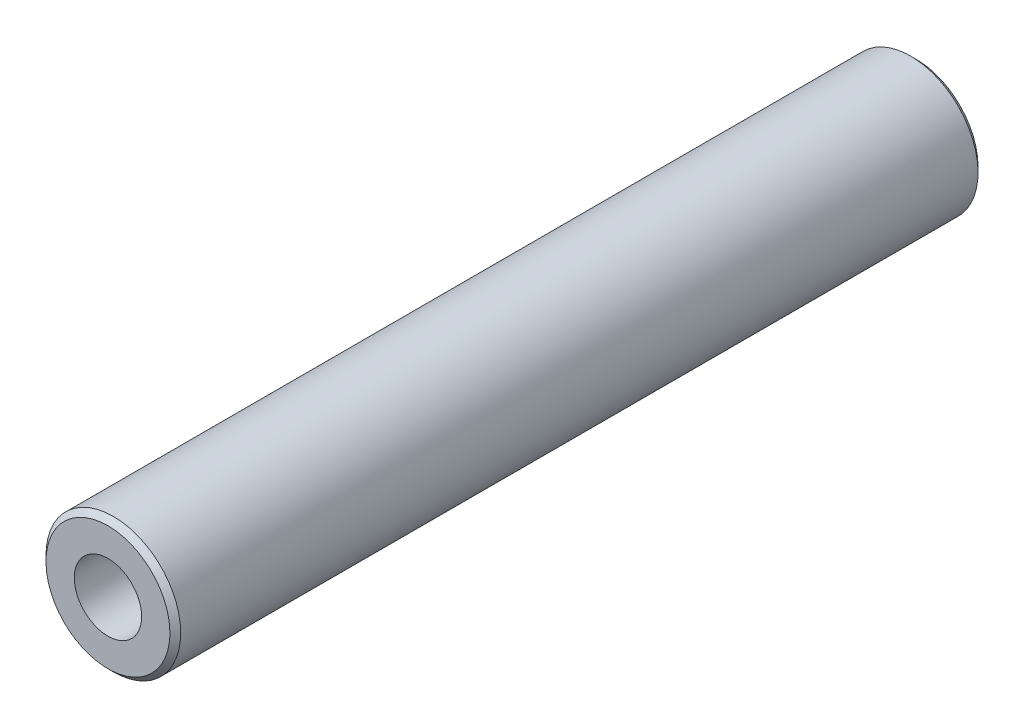
ISO-10303-21;
HEADER;
FILE_DESCRIPTION(('STEP AP214'),'2;1');
FILE_NAME('part.step','',(''),(''),'','','');
FILE_SCHEMA(('AUTOMOTIVE_DESIGN { 1 0 10303 214 1 1 1 1 }'));
ENDSEC;
DATA;
#1=APPLICATION_CONTEXT('core data for automotive mechanical design processes');
#2=APPLICATION_PROTOCOL_DEFINITION('international standard','automotive_design',2000,#1);
#3=PRODUCT_CONTEXT('',#1,'mechanical');
#4=PRODUCT('Part','Part','',(#3));
#5=PRODUCT_RELATED_PRODUCT_CATEGORY('part','',(#4));
#6=PRODUCT_DEFINITION_FORMATION('','',#4);
#7=PRODUCT_DEFINITION_CONTEXT('part definition',#1,'design');
#8=PRODUCT_DEFINITION('design','',#6,#7);
#9=PRODUCT_DEFINITION_SHAPE('','',#8);
#10=(LENGTH_UNIT() NAMED_UNIT(*) SI_UNIT(.MILLI.,.METRE.));
#11=(NAMED_UNIT(*) PLANE_ANGLE_UNIT() SI_UNIT($,.RADIAN.));
#12=(NAMED_UNIT(*) SI_UNIT($,.STERADIAN.) SOLID_ANGLE_UNIT());
#13=UNCERTAINTY_MEASURE_WITH_UNIT(LENGTH_MEASURE(1.E-05),#10,'distance_accuracy_value','');
#14=(GEOMETRIC_REPRESENTATION_CONTEXT(3) GLOBAL_UNCERTAINTY_ASSIGNED_CONTEXT((#13)) GLOBAL_UNIT_ASSIGNED_CONTEXT((#10,
#11,#12)) REPRESENTATION_CONTEXT('',''));
#15=CARTESIAN_POINT('',(0.,0.,0.));
#16=DIRECTION('',(0.,0.,1.));
#17=DIRECTION('',(1.,0.,0.));
#18=AXIS2_PLACEMENT_3D('',#15,#16,#17);
#19=CARTESIAN_POINT('',(0.,0.,15.));
#20=DIRECTION('',(0.,0.,1.));
#21=DIRECTION('',(0.,-1.,0.));
#22=AXIS2_PLACEMENT_3D('',#19,#20,#21);
#23=CYLINDRICAL_SURFACE('',#22,2.5);
#24=CARTESIAN_POINT('',(0.,0.,-14.8));
#25=DIRECTION('',(0.,0.,1.));
#26=DIRECTION('',(0.,-1.,0.));
#27=AXIS2_PLACEMENT_3D('',#24,#25,#26);
#28=CIRCLE('',#27,2.5);
#29=CARTESIAN_POINT('',(0.,-2.5,-14.8));
#30=VERTEX_POINT('',#29);
#31=EDGE_CURVE('E81',#30,#30,#28,.T.);
#32=ORIENTED_EDGE('',*,*,#31,.T.);
#33=EDGE_LOOP('',(#32));
#34=FACE_BOUND('',#33,.T.);
#35=CARTESIAN_POINT('',(0.,0.,14.8));
#36=DIRECTION('',(0.,0.,-1.));
#37=DIRECTION('',(0.,1.,0.));
#38=AXIS2_PLACEMENT_3D('',#35,#36,#37);
#39=CIRCLE('',#38,2.5);
#40=CARTESIAN_POINT('',(0.,2.5,14.8));
#41=VERTEX_POINT('',#40);
#42=EDGE_CURVE('E78',#41,#41,#39,.T.);
#43=ORIENTED_EDGE('',*,*,#42,.T.);
#44=EDGE_LOOP('',(#43));
#45=FACE_BOUND('',#44,.T.);
#46=ADVANCED_FACE('F42',(#34,#45),#23,.T.);
#47=CARTESIAN_POINT('',(0.,2.5,15.));
#48=DIRECTION('',(0.,0.,-1.));
#49=DIRECTION('',(0.,1.,0.));
#50=AXIS2_PLACEMENT_3D('',#47,#48,#49);
#51=PLANE('',#50);
#52=CARTESIAN_POINT('',(0.,0.,15.));
#53=DIRECTION('',(0.,0.,-1.));
#54=DIRECTION('',(0.,1.,0.));
#55=AXIS2_PLACEMENT_3D('',#52,#53,#54);
#56=CIRCLE('',#55,2.3);
#57=CARTESIAN_POINT('',(0.,2.29999999999999,15.));
#58=VERTEX_POINT('',#57);
#59=EDGE_CURVE('E11',#58,#58,#56,.F.);
#60=ORIENTED_EDGE('',*,*,#59,.T.);
#61=EDGE_LOOP('',(#60));
#62=FACE_BOUND('',#61,.T.);
#63=CARTESIAN_POINT('',(0.,0.,15.));
#64=DIRECTION('',(0.,0.,1.));
#65=DIRECTION('',(1.,0.,0.));
#66=AXIS2_PLACEMENT_3D('',#63,#64,#65);
#67=CIRCLE('',#66,1.25);
#68=CARTESIAN_POINT('',(1.25,0.,15.));
#69=VERTEX_POINT('',#68);
#70=EDGE_CURVE('E67',#69,#69,#67,.T.);
#71=ORIENTED_EDGE('',*,*,#70,.F.);
#72=EDGE_LOOP('',(#71));
#73=FACE_BOUND('',#72,.T.);
#74=ADVANCED_FACE('F96',(#62,#73),#51,.F.);
#75=CARTESIAN_POINT('',(0.,0.,-15.));
#76=DIRECTION('',(0.,0.,1.));
#77=DIRECTION('',(0.,-1.,0.));
#78=AXIS2_PLACEMENT_3D('',#75,#76,#77);
#79=PLANE('',#78);
#80=CARTESIAN_POINT('',(0.,0.,-15.));
#81=DIRECTION('',(0.,0.,1.));
#82=DIRECTION('',(0.,-1.,0.));
#83=AXIS2_PLACEMENT_3D('',#80,#81,#82);
#84=CIRCLE('',#83,2.30000000000001);
#85=CARTESIAN_POINT('',(0.,-2.30000000000001,-15.));
#86=VERTEX_POINT('',#85);
#87=EDGE_CURVE('E51',#86,#86,#84,.F.);
#88=ORIENTED_EDGE('',*,*,#87,.T.);
#89=EDGE_LOOP('',(#88));
#90=FACE_BOUND('',#89,.T.);
#91=CARTESIAN_POINT('',(0.,0.,-15.));
#92=DIRECTION('',(0.,0.,-1.));
#93=DIRECTION('',(-1.,0.,0.));
#94=AXIS2_PLACEMENT_3D('',#91,#92,#93);
#95=CIRCLE('',#94,1.25);
#96=CARTESIAN_POINT('',(-1.25,0.,-15.));
#97=VERTEX_POINT('',#96);
#98=EDGE_CURVE('E68',#97,#97,#95,.T.);
#99=ORIENTED_EDGE('',*,*,#98,.F.);
#100=EDGE_LOOP('',(#99));
#101=FACE_BOUND('',#100,.T.);
#102=ADVANCED_FACE('F86',(#90,#101),#79,.F.);
#103=CARTESIAN_POINT('',(0.,0.,1.5));
#104=DIRECTION('',(0.,0.,1.));
#105=DIRECTION('',(1.,0.,0.));
#106=AXIS2_PLACEMENT_3D('',#103,#104,#105);
#107=CONICAL_SURFACE('',#106,1.25,1.02974425867665);
#108=CARTESIAN_POINT('',(0.,0.,0.748924226215548));
#109=VERTEX_POINT('',#108);
#110=VERTEX_LOOP('',#109);
#111=FACE_BOUND('',#110,.T.);
#112=CARTESIAN_POINT('',(0.,0.,1.5));
#113=DIRECTION('',(0.,0.,1.));
#114=DIRECTION('',(1.,0.,0.));
#115=AXIS2_PLACEMENT_3D('',#112,#113,#114);
#116=CIRCLE('',#115,1.25);
#117=CARTESIAN_POINT('',(1.25,0.,1.5));
#118=VERTEX_POINT('',#117);
#119=EDGE_CURVE('E71',#118,#118,#116,.T.);
#120=ORIENTED_EDGE('',*,*,#119,.T.);
#121=EDGE_LOOP('',(#120));
#122=FACE_BOUND('',#121,.T.);
#123=ADVANCED_FACE('F110',(#111,#122),#107,.F.);
#124=CARTESIAN_POINT('',(0.,0.,15.));
#125=DIRECTION('',(0.,0.,1.));
#126=DIRECTION('',(1.,0.,0.));
#127=AXIS2_PLACEMENT_3D('',#124,#125,#126);
#128=CYLINDRICAL_SURFACE('',#127,1.25);
#129=ORIENTED_EDGE('',*,*,#119,.F.);
#130=EDGE_LOOP('',(#129));
#131=FACE_BOUND('',#130,.T.);
#132=ORIENTED_EDGE('',*,*,#70,.T.);
#133=EDGE_LOOP('',(#132));
#134=FACE_BOUND('',#133,.T.);
#135=ADVANCED_FACE('F61',(#131,#134),#128,.F.);
#136=CARTESIAN_POINT('',(0.,0.,-1.5));
#137=DIRECTION('',(0.,0.,-1.));
#138=DIRECTION('',(-1.,0.,0.));
#139=AXIS2_PLACEMENT_3D('',#136,#137,#138);
#140=CONICAL_SURFACE('',#139,1.25,1.02974425867665);
#141=CARTESIAN_POINT('',(0.,0.,-0.748924226215548));
#142=VERTEX_POINT('',#141);
#143=VERTEX_LOOP('',#142);
#144=FACE_BOUND('',#143,.T.);
#145=CARTESIAN_POINT('',(0.,0.,-1.5));
#146=DIRECTION('',(0.,0.,-1.));
#147=DIRECTION('',(-1.,0.,0.));
#148=AXIS2_PLACEMENT_3D('',#145,#146,#147);
#149=CIRCLE('',#148,1.25);
#150=CARTESIAN_POINT('',(-1.25,0.,-1.5));
#151=VERTEX_POINT('',#150);
#152=EDGE_CURVE('E65',#151,#151,#149,.T.);
#153=ORIENTED_EDGE('',*,*,#152,.T.);
#154=EDGE_LOOP('',(#153));
#155=FACE_BOUND('',#154,.T.);
#156=ADVANCED_FACE('F57',(#144,#155),#140,.F.);
#157=CARTESIAN_POINT('',(0.,0.,-15.));
#158=DIRECTION('',(0.,0.,-1.));
#159=DIRECTION('',(-1.,0.,0.));
#160=AXIS2_PLACEMENT_3D('',#157,#158,#159);
#161=CYLINDRICAL_SURFACE('',#160,1.25);
#162=ORIENTED_EDGE('',*,*,#152,.F.);
#163=EDGE_LOOP('',(#162));
#164=FACE_BOUND('',#163,.T.);
#165=ORIENTED_EDGE('',*,*,#98,.T.);
#166=EDGE_LOOP('',(#165));
#167=FACE_BOUND('',#166,.T.);
#168=ADVANCED_FACE('F60',(#164,#167),#161,.F.);
#169=CARTESIAN_POINT('',(0.,0.,-14.8));
#170=DIRECTION('',(0.,0.,1.));
#171=DIRECTION('',(0.,-1.,0.));
#172=AXIS2_PLACEMENT_3D('',#169,#170,#171);
#173=CONICAL_SURFACE('',#172,2.5,0.785398163397439);
#174=ORIENTED_EDGE('',*,*,#87,.F.);
#175=EDGE_LOOP('',(#174));
#176=FACE_BOUND('',#175,.T.);
#177=ORIENTED_EDGE('',*,*,#31,.F.);
#178=EDGE_LOOP('',(#177));
#179=FACE_BOUND('',#178,.T.);
#180=ADVANCED_FACE('F89',(#176,#179),#173,.T.);
#181=CARTESIAN_POINT('',(0.,0.,15.));
#182=DIRECTION('',(0.,0.,-1.));
#183=DIRECTION('',(0.,1.,0.));
#184=AXIS2_PLACEMENT_3D('',#181,#182,#183);
#185=CONICAL_SURFACE('',#184,2.3,0.785398163397434);
#186=CARTESIAN_POINT('',(0.,2.5,14.8));
#187=CARTESIAN_POINT('',(0.,2.49791666666666,14.8020833333333));
#188=CARTESIAN_POINT('',(0.,2.49583333333333,14.8041666666667));
#189=CARTESIAN_POINT('',(0.,2.49166666666666,14.8083333333333));
#190=CARTESIAN_POINT('',(0.,2.48958333333333,14.8104166666667));
#191=CARTESIAN_POINT('',(0.,2.48541666666666,14.8145833333333));
#192=CARTESIAN_POINT('',(0.,2.48333333333333,14.8166666666667));
#193=CARTESIAN_POINT('',(0.,2.47916666666666,14.8208333333333));
#194=CARTESIAN_POINT('',(0.,2.47708333333333,14.8229166666667));
#195=CARTESIAN_POINT('',(0.,2.47291666666666,14.8270833333333));
#196=CARTESIAN_POINT('',(0.,2.47083333333333,14.8291666666667));
#197=CARTESIAN_POINT('',(0.,2.46666666666666,14.8333333333333));
#198=CARTESIAN_POINT('',(0.,2.46458333333333,14.8354166666667));
#199=CARTESIAN_POINT('',(0.,2.46041666666666,14.8395833333333));
#200=CARTESIAN_POINT('',(0.,2.45833333333333,14.8416666666667));
#201=CARTESIAN_POINT('',(0.,2.45416666666666,14.8458333333333));
#202=CARTESIAN_POINT('',(0.,2.45208333333333,14.8479166666667));
#203=CARTESIAN_POINT('',(0.,2.44791666666666,14.8520833333333));
#204=CARTESIAN_POINT('',(0.,2.44583333333333,14.8541666666667));
#205=CARTESIAN_POINT('',(0.,2.44166666666666,14.8583333333333));
#206=CARTESIAN_POINT('',(0.,2.43958333333333,14.8604166666667));
#207=CARTESIAN_POINT('',(0.,2.43541666666666,14.8645833333333));
#208=CARTESIAN_POINT('',(0.,2.43333333333333,14.8666666666667));
#209=CARTESIAN_POINT('',(0.,2.42916666666666,14.8708333333333));
#210=CARTESIAN_POINT('',(0.,2.42708333333333,14.8729166666667));
#211=CARTESIAN_POINT('',(0.,2.42291666666666,14.8770833333333));
#212=CARTESIAN_POINT('',(0.,2.42083333333333,14.8791666666667));
#213=CARTESIAN_POINT('',(0.,2.41666666666666,14.8833333333333));
#214=CARTESIAN_POINT('',(0.,2.41458333333333,14.8854166666667));
#215=CARTESIAN_POINT('',(0.,2.41041666666666,14.8895833333333));
#216=CARTESIAN_POINT('',(0.,2.40833333333333,14.8916666666667));
#217=CARTESIAN_POINT('',(0.,2.40416666666666,14.8958333333333));
#218=CARTESIAN_POINT('',(0.,2.40208333333333,14.8979166666667));
#219=CARTESIAN_POINT('',(0.,2.39791666666666,14.9020833333333));
#220=CARTESIAN_POINT('',(0.,2.39583333333333,14.9041666666667));
#221=CARTESIAN_POINT('',(0.,2.39166666666666,14.9083333333333));
#222=CARTESIAN_POINT('',(0.,2.38958333333333,14.9104166666667));
#223=CARTESIAN_POINT('',(0.,2.38541666666666,14.9145833333333));
#224=CARTESIAN_POINT('',(0.,2.38333333333333,14.9166666666667));
#225=CARTESIAN_POINT('',(0.,2.37916666666666,14.9208333333333));
#226=CARTESIAN_POINT('',(0.,2.37708333333333,14.9229166666667));
#227=CARTESIAN_POINT('',(0.,2.37291666666666,14.9270833333333));
#228=CARTESIAN_POINT('',(0.,2.37083333333333,14.9291666666667));
#229=CARTESIAN_POINT('',(0.,2.36666666666666,14.9333333333333));
#230=CARTESIAN_POINT('',(0.,2.36458333333333,14.9354166666667));
#231=CARTESIAN_POINT('',(0.,2.36041666666666,14.9395833333333));
#232=CARTESIAN_POINT('',(0.,2.35833333333332,14.9416666666667));
#233=CARTESIAN_POINT('',(0.,2.35416666666666,14.9458333333333));
#234=CARTESIAN_POINT('',(0.,2.35208333333333,14.9479166666667));
#235=CARTESIAN_POINT('',(0.,2.34791666666666,14.9520833333333));
#236=CARTESIAN_POINT('',(0.,2.34583333333332,14.9541666666667));
#237=CARTESIAN_POINT('',(0.,2.34166666666666,14.9583333333333));
#238=CARTESIAN_POINT('',(0.,2.33958333333332,14.9604166666667));
#239=CARTESIAN_POINT('',(0.,2.33541666666666,14.9645833333333));
#240=CARTESIAN_POINT('',(0.,2.33333333333333,14.9666666666667));
#241=CARTESIAN_POINT('',(0.,2.32916666666666,14.9708333333333));
#242=CARTESIAN_POINT('',(0.,2.32708333333332,14.9729166666667));
#243=CARTESIAN_POINT('',(0.,2.32291666666666,14.9770833333333));
#244=CARTESIAN_POINT('',(0.,2.32083333333332,14.9791666666667));
#245=CARTESIAN_POINT('',(0.,2.31666666666666,14.9833333333333));
#246=CARTESIAN_POINT('',(0.,2.31458333333332,14.9854166666667));
#247=CARTESIAN_POINT('',(0.,2.31041666666666,14.9895833333333));
#248=CARTESIAN_POINT('',(0.,2.30833333333332,14.9916666666667));
#249=CARTESIAN_POINT('',(0.,2.30416666666666,14.9958333333333));
#250=CARTESIAN_POINT('',(0.,2.30208333333332,14.9979166666667));
#251=CARTESIAN_POINT('',(0.,2.29999999999999,15.));
#252=B_SPLINE_CURVE_WITH_KNOTS('',3,(#186,#187,#188,#189,#190,#191,#192,#193,#194,#195,#196,
#197,#198,#199,#200,#201,#202,#203,#204,#205,#206,#207,#208,#209,#210,#211,#212,#213,#214,#215,
#216,#217,#218,#219,#220,#221,#222,#223,#224,#225,#226,#227,#228,#229,#230,#231,#232,#233,#234,
#235,#236,#237,#238,#239,#240,#241,#242,#243,#244,#245,#246,#247,#248,#249,#250,#251),
.UNSPECIFIED.,.F.,.F.,(4,2,2,2,2,2,2,2,2,2,2,2,2,2,2,2,2,2,2,2,2,2,2,2,2,2,2,2,2,2,2,2,4),(0.,
0.00883883476483271,0.0176776695296654,0.0265165042944969,0.0353553390593296,0.0441941738241611,
0.0530330085889938,0.0618718433538265,0.070710678118658,0.0795495128834907,0.0883883476483222,
0.0972271824131549,0.106066017177988,0.114904851942819,0.123743686707652,0.132582521472483,
0.141421356237316,0.150260191002148,0.15909902576698,0.167937860531813,0.176776695296644,
0.185615530061477,0.19445436482631,0.203293199591141,0.212132034355974,0.220970869120805,
0.229809703885638,0.238648538650471,0.247487373415302,0.256326208180135,0.265165042944966,
0.274003877709799,0.28284271247463),.UNSPECIFIED.);
#253=EDGE_CURVE('BSEAM45',#41,#58,#252,.T.);
#254=ORIENTED_EDGE('',*,*,#42,.F.);
#255=ORIENTED_EDGE('',*,*,#59,.F.);
#256=ORIENTED_EDGE('',*,*,#253,.T.);
#257=ORIENTED_EDGE('',*,*,#253,.F.);
#258=EDGE_LOOP('',(#254,#256,#255,#257));
#259=FACE_BOUND('',#258,.T.);
#260=ADVANCED_FACE('F45',(#259),#185,.T.);
#261=CLOSED_SHELL('',(#46,#74,#102,#123,#135,#156,#168,#180,#260));
#262=MANIFOLD_SOLID_BREP('B2',#261);
#263=ADVANCED_BREP_SHAPE_REPRESENTATION('',(#18,#262),#14);
#264=SHAPE_DEFINITION_REPRESENTATION(#9,#263);
ENDSEC;
END-ISO-10303-21;
